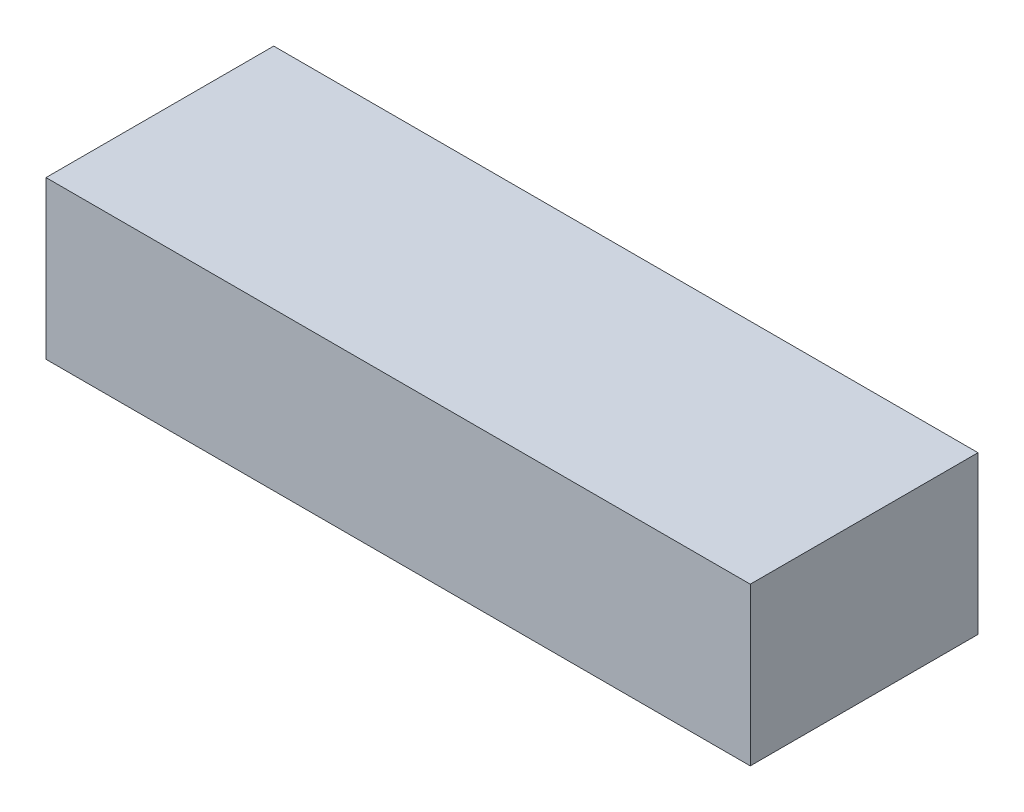
ISO-10303-21;
HEADER;
FILE_DESCRIPTION(('STEP AP214'),'2;1');
FILE_NAME('part.step','',(''),(''),'','','');
FILE_SCHEMA(('AUTOMOTIVE_DESIGN { 1 0 10303 214 1 1 1 1 }'));
ENDSEC;
DATA;
#1=APPLICATION_CONTEXT('core data for automotive mechanical design processes');
#2=APPLICATION_PROTOCOL_DEFINITION('international standard','automotive_design',2000,#1);
#3=PRODUCT_CONTEXT('',#1,'mechanical');
#4=PRODUCT('Part','Part','',(#3));
#5=PRODUCT_RELATED_PRODUCT_CATEGORY('part','',(#4));
#6=PRODUCT_DEFINITION_FORMATION('','',#4);
#7=PRODUCT_DEFINITION_CONTEXT('part definition',#1,'design');
#8=PRODUCT_DEFINITION('design','',#6,#7);
#9=PRODUCT_DEFINITION_SHAPE('','',#8);
#10=(LENGTH_UNIT() NAMED_UNIT(*) SI_UNIT(.MILLI.,.METRE.));
#11=(NAMED_UNIT(*) PLANE_ANGLE_UNIT() SI_UNIT($,.RADIAN.));
#12=(NAMED_UNIT(*) SI_UNIT($,.STERADIAN.) SOLID_ANGLE_UNIT());
#13=UNCERTAINTY_MEASURE_WITH_UNIT(LENGTH_MEASURE(1.E-05),#10,'distance_accuracy_value','');
#14=(GEOMETRIC_REPRESENTATION_CONTEXT(3) GLOBAL_UNCERTAINTY_ASSIGNED_CONTEXT((#13)) GLOBAL_UNIT_ASSIGNED_CONTEXT((#10,
#11,#12)) REPRESENTATION_CONTEXT('',''));
#15=CARTESIAN_POINT('',(0.,0.,0.));
#16=DIRECTION('',(0.,0.,1.));
#17=DIRECTION('',(1.,0.,0.));
#18=AXIS2_PLACEMENT_3D('',#15,#16,#17);
#19=CARTESIAN_POINT('',(52.575,23.5,17.));
#20=DIRECTION('',(-1.,0.,0.));
#21=DIRECTION('',(0.,0.,1.));
#22=AXIS2_PLACEMENT_3D('',#19,#20,#21);
#23=PLANE('',#22);
#24=DIRECTION('',(0.,0.,-1.));
#25=VECTOR('',#24,1.);
#26=CARTESIAN_POINT('',(52.575,0.,17.));
#27=LINE('',#26,#25);
#28=CARTESIAN_POINT('',(52.575,0.,17.));
#29=VERTEX_POINT('',#28);
#30=CARTESIAN_POINT('',(52.575,0.,-17.));
#31=VERTEX_POINT('',#30);
#32=EDGE_CURVE('E111',#29,#31,#27,.T.);
#33=ORIENTED_EDGE('',*,*,#32,.T.);
#34=DIRECTION('',(0.,-1.,0.));
#35=VECTOR('',#34,1.);
#36=CARTESIAN_POINT('',(52.575,23.5,-17.));
#37=LINE('',#36,#35);
#38=CARTESIAN_POINT('',(52.575,23.5,-17.));
#39=VERTEX_POINT('',#38);
#40=EDGE_CURVE('E11',#39,#31,#37,.T.);
#41=ORIENTED_EDGE('',*,*,#40,.F.);
#42=DIRECTION('',(0.,0.,-1.));
#43=VECTOR('',#42,1.);
#44=CARTESIAN_POINT('',(52.575,23.5,17.));
#45=LINE('',#44,#43);
#46=CARTESIAN_POINT('',(52.575,23.5,17.));
#47=VERTEX_POINT('',#46);
#48=EDGE_CURVE('E95',#47,#39,#45,.T.);
#49=ORIENTED_EDGE('',*,*,#48,.F.);
#50=DIRECTION('',(0.,-1.,0.));
#51=VECTOR('',#50,1.);
#52=CARTESIAN_POINT('',(52.575,23.5,17.));
#53=LINE('',#52,#51);
#54=EDGE_CURVE('E107',#47,#29,#53,.T.);
#55=ORIENTED_EDGE('',*,*,#54,.T.);
#56=EDGE_LOOP('',(#33,#41,#49,#55));
#57=FACE_BOUND('',#56,.T.);
#58=ADVANCED_FACE('F43',(#57),#23,.F.);
#59=CARTESIAN_POINT('',(-52.575,23.5,-17.));
#60=DIRECTION('',(0.,0.,1.));
#61=DIRECTION('',(1.,0.,0.));
#62=AXIS2_PLACEMENT_3D('',#59,#60,#61);
#63=PLANE('',#62);
#64=DIRECTION('',(-1.,0.,0.));
#65=VECTOR('',#64,1.);
#66=CARTESIAN_POINT('',(-52.575,0.,-17.));
#67=LINE('',#66,#65);
#68=CARTESIAN_POINT('',(-52.575,0.,-17.));
#69=VERTEX_POINT('',#68);
#70=EDGE_CURVE('E100',#31,#69,#67,.T.);
#71=ORIENTED_EDGE('',*,*,#70,.T.);
#72=DIRECTION('',(0.,-1.,0.));
#73=VECTOR('',#72,1.);
#74=CARTESIAN_POINT('',(-52.575,23.5,-17.));
#75=LINE('',#74,#73);
#76=CARTESIAN_POINT('',(-52.575,23.5,-17.));
#77=VERTEX_POINT('',#76);
#78=EDGE_CURVE('E52',#77,#69,#75,.T.);
#79=ORIENTED_EDGE('',*,*,#78,.F.);
#80=DIRECTION('',(-1.,0.,0.));
#81=VECTOR('',#80,1.);
#82=CARTESIAN_POINT('',(-52.575,23.5,-17.));
#83=LINE('',#82,#81);
#84=EDGE_CURVE('E90',#39,#77,#83,.T.);
#85=ORIENTED_EDGE('',*,*,#84,.F.);
#86=ORIENTED_EDGE('',*,*,#40,.T.);
#87=EDGE_LOOP('',(#71,#79,#85,#86));
#88=FACE_BOUND('',#87,.T.);
#89=ADVANCED_FACE('F99',(#88),#63,.F.);
#90=CARTESIAN_POINT('',(-52.575,23.5,17.));
#91=DIRECTION('',(1.,0.,0.));
#92=DIRECTION('',(0.,0.,-1.));
#93=AXIS2_PLACEMENT_3D('',#90,#91,#92);
#94=PLANE('',#93);
#95=DIRECTION('',(0.,0.,1.));
#96=VECTOR('',#95,1.);
#97=CARTESIAN_POINT('',(-52.575,0.,17.));
#98=LINE('',#97,#96);
#99=CARTESIAN_POINT('',(-52.575,0.,17.));
#100=VERTEX_POINT('',#99);
#101=EDGE_CURVE('E77',#69,#100,#98,.T.);
#102=ORIENTED_EDGE('',*,*,#101,.T.);
#103=DIRECTION('',(0.,-1.,0.));
#104=VECTOR('',#103,1.);
#105=CARTESIAN_POINT('',(-52.575,23.5,17.));
#106=LINE('',#105,#104);
#107=CARTESIAN_POINT('',(-52.575,23.5,17.));
#108=VERTEX_POINT('',#107);
#109=EDGE_CURVE('E102',#108,#100,#106,.T.);
#110=ORIENTED_EDGE('',*,*,#109,.F.);
#111=DIRECTION('',(0.,0.,1.));
#112=VECTOR('',#111,1.);
#113=CARTESIAN_POINT('',(-52.575,23.5,17.));
#114=LINE('',#113,#112);
#115=EDGE_CURVE('E93',#77,#108,#114,.T.);
#116=ORIENTED_EDGE('',*,*,#115,.F.);
#117=ORIENTED_EDGE('',*,*,#78,.T.);
#118=EDGE_LOOP('',(#102,#110,#116,#117));
#119=FACE_BOUND('',#118,.T.);
#120=ADVANCED_FACE('F103',(#119),#94,.F.);
#121=CARTESIAN_POINT('',(-52.575,23.5,17.));
#122=DIRECTION('',(0.,0.,-1.));
#123=DIRECTION('',(-1.,0.,0.));
#124=AXIS2_PLACEMENT_3D('',#121,#122,#123);
#125=PLANE('',#124);
#126=DIRECTION('',(1.,0.,0.));
#127=VECTOR('',#126,1.);
#128=CARTESIAN_POINT('',(-52.575,0.,17.));
#129=LINE('',#128,#127);
#130=EDGE_CURVE('E83',#100,#29,#129,.T.);
#131=ORIENTED_EDGE('',*,*,#130,.T.);
#132=ORIENTED_EDGE('',*,*,#54,.F.);
#133=DIRECTION('',(1.,0.,0.));
#134=VECTOR('',#133,1.);
#135=CARTESIAN_POINT('',(-52.575,23.5,17.));
#136=LINE('',#135,#134);
#137=EDGE_CURVE('E60',#108,#47,#136,.T.);
#138=ORIENTED_EDGE('',*,*,#137,.F.);
#139=ORIENTED_EDGE('',*,*,#109,.T.);
#140=EDGE_LOOP('',(#131,#132,#138,#139));
#141=FACE_BOUND('',#140,.T.);
#142=ADVANCED_FACE('F124',(#141),#125,.F.);
#143=CARTESIAN_POINT('',(0.,23.5,0.));
#144=DIRECTION('',(0.,-1.,0.));
#145=DIRECTION('',(0.,0.,-1.));
#146=AXIS2_PLACEMENT_3D('',#143,#144,#145);
#147=PLANE('',#146);
#148=ORIENTED_EDGE('',*,*,#48,.T.);
#149=ORIENTED_EDGE('',*,*,#84,.T.);
#150=ORIENTED_EDGE('',*,*,#115,.T.);
#151=ORIENTED_EDGE('',*,*,#137,.T.);
#152=EDGE_LOOP('',(#148,#149,#150,#151));
#153=FACE_BOUND('',#152,.T.);
#154=ADVANCED_FACE('F91',(#153),#147,.F.);
#155=CARTESIAN_POINT('',(0.,0.,0.));
#156=DIRECTION('',(0.,-1.,0.));
#157=DIRECTION('',(0.,0.,-1.));
#158=AXIS2_PLACEMENT_3D('',#155,#156,#157);
#159=PLANE('',#158);
#160=ORIENTED_EDGE('',*,*,#32,.F.);
#161=ORIENTED_EDGE('',*,*,#130,.F.);
#162=ORIENTED_EDGE('',*,*,#101,.F.);
#163=ORIENTED_EDGE('',*,*,#70,.F.);
#164=EDGE_LOOP('',(#160,#161,#162,#163));
#165=FACE_BOUND('',#164,.T.);
#166=ADVANCED_FACE('F127',(#165),#159,.T.);
#167=CLOSED_SHELL('',(#58,#89,#120,#142,#154,#166));
#168=MANIFOLD_SOLID_BREP('B2',#167);
#169=ADVANCED_BREP_SHAPE_REPRESENTATION('',(#18,#168),#14);
#170=SHAPE_DEFINITION_REPRESENTATION(#9,#169);
ENDSEC;
END-ISO-10303-21;
